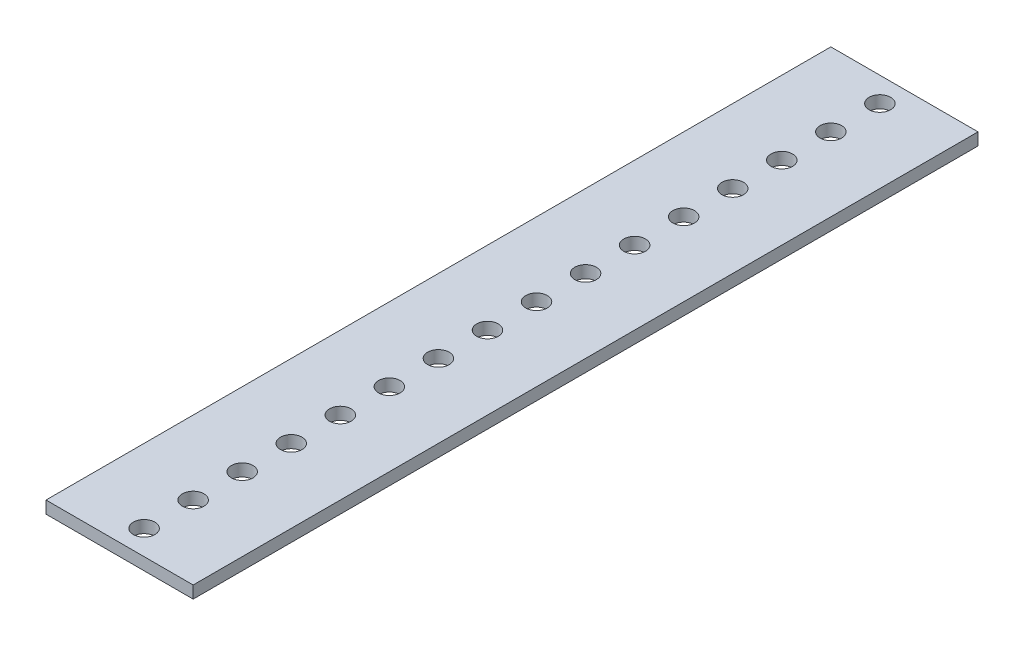
ISO-10303-21;
HEADER;
FILE_DESCRIPTION(('STEP AP214'),'2;1');
FILE_NAME('part.step','',(''),(''),'','','');
FILE_SCHEMA(('AUTOMOTIVE_DESIGN { 1 0 10303 214 1 1 1 1 }'));
ENDSEC;
DATA;
#1=APPLICATION_CONTEXT('core data for automotive mechanical design processes');
#2=APPLICATION_PROTOCOL_DEFINITION('international standard','automotive_design',2000,#1);
#3=PRODUCT_CONTEXT('',#1,'mechanical');
#4=PRODUCT('Part','Part','',(#3));
#5=PRODUCT_RELATED_PRODUCT_CATEGORY('part','',(#4));
#6=PRODUCT_DEFINITION_FORMATION('','',#4);
#7=PRODUCT_DEFINITION_CONTEXT('part definition',#1,'design');
#8=PRODUCT_DEFINITION('design','',#6,#7);
#9=PRODUCT_DEFINITION_SHAPE('','',#8);
#10=(LENGTH_UNIT() NAMED_UNIT(*) SI_UNIT(.MILLI.,.METRE.));
#11=(NAMED_UNIT(*) PLANE_ANGLE_UNIT() SI_UNIT($,.RADIAN.));
#12=(NAMED_UNIT(*) SI_UNIT($,.STERADIAN.) SOLID_ANGLE_UNIT());
#13=UNCERTAINTY_MEASURE_WITH_UNIT(LENGTH_MEASURE(1.E-05),#10,'distance_accuracy_value','');
#14=(GEOMETRIC_REPRESENTATION_CONTEXT(3) GLOBAL_UNCERTAINTY_ASSIGNED_CONTEXT((#13)) GLOBAL_UNIT_ASSIGNED_CONTEXT((#10,
#11,#12)) REPRESENTATION_CONTEXT('',''));
#15=CARTESIAN_POINT('',(0.,0.,0.));
#16=DIRECTION('',(0.,0.,1.));
#17=DIRECTION('',(1.,0.,0.));
#18=AXIS2_PLACEMENT_3D('',#15,#16,#17);
#19=CARTESIAN_POINT('',(0.,0.,-95.25));
#20=DIRECTION('',(0.,1.,0.));
#21=DIRECTION('',(0.,0.,1.));
#22=AXIS2_PLACEMENT_3D('',#19,#20,#21);
#23=CYLINDRICAL_SURFACE('',#22,2.79400000000001);
#24=CARTESIAN_POINT('',(0.,0.,-95.25));
#25=DIRECTION('',(0.,1.,0.));
#26=DIRECTION('',(0.,0.,1.));
#27=AXIS2_PLACEMENT_3D('',#24,#25,#26);
#28=CIRCLE('',#27,2.79400000000001);
#29=CARTESIAN_POINT('',(0.,0.,-92.456));
#30=VERTEX_POINT('',#29);
#31=EDGE_CURVE('E45',#30,#30,#28,.T.);
#32=ORIENTED_EDGE('',*,*,#31,.F.);
#33=EDGE_LOOP('',(#32));
#34=FACE_BOUND('',#33,.T.);
#35=CARTESIAN_POINT('',(0.,3.175,-95.25));
#36=DIRECTION('',(0.,1.,0.));
#37=DIRECTION('',(0.,0.,1.));
#38=AXIS2_PLACEMENT_3D('',#35,#36,#37);
#39=CIRCLE('',#38,2.79400000000001);
#40=CARTESIAN_POINT('',(0.,3.175,-92.456));
#41=VERTEX_POINT('',#40);
#42=EDGE_CURVE('E11',#41,#41,#39,.T.);
#43=ORIENTED_EDGE('',*,*,#42,.T.);
#44=EDGE_LOOP('',(#43));
#45=FACE_BOUND('',#44,.T.);
#46=ADVANCED_FACE('F37',(#34,#45),#23,.F.);
#47=CARTESIAN_POINT('',(0.,0.,-82.55));
#48=DIRECTION('',(0.,1.,0.));
#49=DIRECTION('',(0.,0.,1.));
#50=AXIS2_PLACEMENT_3D('',#47,#48,#49);
#51=CYLINDRICAL_SURFACE('',#50,2.79400000000001);
#52=CARTESIAN_POINT('',(0.,0.,-82.55));
#53=DIRECTION('',(0.,1.,0.));
#54=DIRECTION('',(0.,0.,1.));
#55=AXIS2_PLACEMENT_3D('',#52,#53,#54);
#56=CIRCLE('',#55,2.79400000000001);
#57=CARTESIAN_POINT('',(0.,0.,-79.756));
#58=VERTEX_POINT('',#57);
#59=EDGE_CURVE('E187',#58,#58,#56,.T.);
#60=ORIENTED_EDGE('',*,*,#59,.F.);
#61=EDGE_LOOP('',(#60));
#62=FACE_BOUND('',#61,.T.);
#63=CARTESIAN_POINT('',(0.,3.175,-82.55));
#64=DIRECTION('',(0.,1.,0.));
#65=DIRECTION('',(0.,0.,1.));
#66=AXIS2_PLACEMENT_3D('',#63,#64,#65);
#67=CIRCLE('',#66,2.79400000000001);
#68=CARTESIAN_POINT('',(0.,3.175,-79.756));
#69=VERTEX_POINT('',#68);
#70=EDGE_CURVE('E190',#69,#69,#67,.T.);
#71=ORIENTED_EDGE('',*,*,#70,.T.);
#72=EDGE_LOOP('',(#71));
#73=FACE_BOUND('',#72,.T.);
#74=ADVANCED_FACE('F199',(#62,#73),#51,.F.);
#75=CARTESIAN_POINT('',(0.,0.,-69.85));
#76=DIRECTION('',(0.,1.,0.));
#77=DIRECTION('',(0.,0.,1.));
#78=AXIS2_PLACEMENT_3D('',#75,#76,#77);
#79=CYLINDRICAL_SURFACE('',#78,2.79400000000001);
#80=CARTESIAN_POINT('',(0.,0.,-69.85));
#81=DIRECTION('',(0.,1.,0.));
#82=DIRECTION('',(0.,0.,1.));
#83=AXIS2_PLACEMENT_3D('',#80,#81,#82);
#84=CIRCLE('',#83,2.79400000000001);
#85=CARTESIAN_POINT('',(0.,0.,-67.056));
#86=VERTEX_POINT('',#85);
#87=EDGE_CURVE('E181',#86,#86,#84,.T.);
#88=ORIENTED_EDGE('',*,*,#87,.F.);
#89=EDGE_LOOP('',(#88));
#90=FACE_BOUND('',#89,.T.);
#91=CARTESIAN_POINT('',(0.,3.175,-69.85));
#92=DIRECTION('',(0.,1.,0.));
#93=DIRECTION('',(0.,0.,1.));
#94=AXIS2_PLACEMENT_3D('',#91,#92,#93);
#95=CIRCLE('',#94,2.79400000000001);
#96=CARTESIAN_POINT('',(0.,3.175,-67.056));
#97=VERTEX_POINT('',#96);
#98=EDGE_CURVE('E184',#97,#97,#95,.T.);
#99=ORIENTED_EDGE('',*,*,#98,.T.);
#100=EDGE_LOOP('',(#99));
#101=FACE_BOUND('',#100,.T.);
#102=ADVANCED_FACE('F270',(#90,#101),#79,.F.);
#103=CARTESIAN_POINT('',(0.,0.,-57.15));
#104=DIRECTION('',(0.,1.,0.));
#105=DIRECTION('',(0.,0.,1.));
#106=AXIS2_PLACEMENT_3D('',#103,#104,#105);
#107=CYLINDRICAL_SURFACE('',#106,2.79400000000001);
#108=CARTESIAN_POINT('',(0.,0.,-57.15));
#109=DIRECTION('',(0.,1.,0.));
#110=DIRECTION('',(0.,0.,1.));
#111=AXIS2_PLACEMENT_3D('',#108,#109,#110);
#112=CIRCLE('',#111,2.79400000000001);
#113=CARTESIAN_POINT('',(0.,0.,-54.356));
#114=VERTEX_POINT('',#113);
#115=EDGE_CURVE('E175',#114,#114,#112,.T.);
#116=ORIENTED_EDGE('',*,*,#115,.F.);
#117=EDGE_LOOP('',(#116));
#118=FACE_BOUND('',#117,.T.);
#119=CARTESIAN_POINT('',(0.,3.175,-57.15));
#120=DIRECTION('',(0.,1.,0.));
#121=DIRECTION('',(0.,0.,1.));
#122=AXIS2_PLACEMENT_3D('',#119,#120,#121);
#123=CIRCLE('',#122,2.79400000000001);
#124=CARTESIAN_POINT('',(0.,3.175,-54.356));
#125=VERTEX_POINT('',#124);
#126=EDGE_CURVE('E178',#125,#125,#123,.T.);
#127=ORIENTED_EDGE('',*,*,#126,.T.);
#128=EDGE_LOOP('',(#127));
#129=FACE_BOUND('',#128,.T.);
#130=ADVANCED_FACE('F266',(#118,#129),#107,.F.);
#131=CARTESIAN_POINT('',(0.,0.,-44.45));
#132=DIRECTION('',(0.,1.,0.));
#133=DIRECTION('',(0.,0.,1.));
#134=AXIS2_PLACEMENT_3D('',#131,#132,#133);
#135=CYLINDRICAL_SURFACE('',#134,2.79400000000001);
#136=CARTESIAN_POINT('',(0.,0.,-44.45));
#137=DIRECTION('',(0.,1.,0.));
#138=DIRECTION('',(0.,0.,1.));
#139=AXIS2_PLACEMENT_3D('',#136,#137,#138);
#140=CIRCLE('',#139,2.79400000000001);
#141=CARTESIAN_POINT('',(0.,0.,-41.656));
#142=VERTEX_POINT('',#141);
#143=EDGE_CURVE('E169',#142,#142,#140,.T.);
#144=ORIENTED_EDGE('',*,*,#143,.F.);
#145=EDGE_LOOP('',(#144));
#146=FACE_BOUND('',#145,.T.);
#147=CARTESIAN_POINT('',(0.,3.175,-44.45));
#148=DIRECTION('',(0.,1.,0.));
#149=DIRECTION('',(0.,0.,1.));
#150=AXIS2_PLACEMENT_3D('',#147,#148,#149);
#151=CIRCLE('',#150,2.79400000000001);
#152=CARTESIAN_POINT('',(0.,3.175,-41.656));
#153=VERTEX_POINT('',#152);
#154=EDGE_CURVE('E172',#153,#153,#151,.T.);
#155=ORIENTED_EDGE('',*,*,#154,.T.);
#156=EDGE_LOOP('',(#155));
#157=FACE_BOUND('',#156,.T.);
#158=ADVANCED_FACE('F262',(#146,#157),#135,.F.);
#159=CARTESIAN_POINT('',(0.,0.,-31.75));
#160=DIRECTION('',(0.,1.,0.));
#161=DIRECTION('',(0.,0.,1.));
#162=AXIS2_PLACEMENT_3D('',#159,#160,#161);
#163=CYLINDRICAL_SURFACE('',#162,2.79400000000001);
#164=CARTESIAN_POINT('',(0.,0.,-31.75));
#165=DIRECTION('',(0.,1.,0.));
#166=DIRECTION('',(0.,0.,1.));
#167=AXIS2_PLACEMENT_3D('',#164,#165,#166);
#168=CIRCLE('',#167,2.79400000000001);
#169=CARTESIAN_POINT('',(0.,0.,-28.956));
#170=VERTEX_POINT('',#169);
#171=EDGE_CURVE('E163',#170,#170,#168,.T.);
#172=ORIENTED_EDGE('',*,*,#171,.F.);
#173=EDGE_LOOP('',(#172));
#174=FACE_BOUND('',#173,.T.);
#175=CARTESIAN_POINT('',(0.,3.175,-31.75));
#176=DIRECTION('',(0.,1.,0.));
#177=DIRECTION('',(0.,0.,1.));
#178=AXIS2_PLACEMENT_3D('',#175,#176,#177);
#179=CIRCLE('',#178,2.79400000000001);
#180=CARTESIAN_POINT('',(0.,3.175,-28.956));
#181=VERTEX_POINT('',#180);
#182=EDGE_CURVE('E166',#181,#181,#179,.T.);
#183=ORIENTED_EDGE('',*,*,#182,.T.);
#184=EDGE_LOOP('',(#183));
#185=FACE_BOUND('',#184,.T.);
#186=ADVANCED_FACE('F258',(#174,#185),#163,.F.);
#187=CARTESIAN_POINT('',(0.,0.,-19.05));
#188=DIRECTION('',(0.,1.,0.));
#189=DIRECTION('',(0.,0.,1.));
#190=AXIS2_PLACEMENT_3D('',#187,#188,#189);
#191=CYLINDRICAL_SURFACE('',#190,2.79400000000001);
#192=CARTESIAN_POINT('',(0.,0.,-19.05));
#193=DIRECTION('',(0.,1.,0.));
#194=DIRECTION('',(0.,0.,1.));
#195=AXIS2_PLACEMENT_3D('',#192,#193,#194);
#196=CIRCLE('',#195,2.79400000000001);
#197=CARTESIAN_POINT('',(0.,0.,-16.256));
#198=VERTEX_POINT('',#197);
#199=EDGE_CURVE('E157',#198,#198,#196,.T.);
#200=ORIENTED_EDGE('',*,*,#199,.F.);
#201=EDGE_LOOP('',(#200));
#202=FACE_BOUND('',#201,.T.);
#203=CARTESIAN_POINT('',(0.,3.175,-19.05));
#204=DIRECTION('',(0.,1.,0.));
#205=DIRECTION('',(0.,0.,1.));
#206=AXIS2_PLACEMENT_3D('',#203,#204,#205);
#207=CIRCLE('',#206,2.79400000000001);
#208=CARTESIAN_POINT('',(0.,3.175,-16.256));
#209=VERTEX_POINT('',#208);
#210=EDGE_CURVE('E160',#209,#209,#207,.T.);
#211=ORIENTED_EDGE('',*,*,#210,.T.);
#212=EDGE_LOOP('',(#211));
#213=FACE_BOUND('',#212,.T.);
#214=ADVANCED_FACE('F254',(#202,#213),#191,.F.);
#215=CARTESIAN_POINT('',(0.,0.,-6.35000000000001));
#216=DIRECTION('',(0.,1.,0.));
#217=DIRECTION('',(0.,0.,1.));
#218=AXIS2_PLACEMENT_3D('',#215,#216,#217);
#219=CYLINDRICAL_SURFACE('',#218,2.79400000000001);
#220=CARTESIAN_POINT('',(0.,0.,-6.35000000000001));
#221=DIRECTION('',(0.,1.,0.));
#222=DIRECTION('',(0.,0.,1.));
#223=AXIS2_PLACEMENT_3D('',#220,#221,#222);
#224=CIRCLE('',#223,2.79400000000001);
#225=CARTESIAN_POINT('',(0.,0.,-3.556));
#226=VERTEX_POINT('',#225);
#227=EDGE_CURVE('E151',#226,#226,#224,.T.);
#228=ORIENTED_EDGE('',*,*,#227,.F.);
#229=EDGE_LOOP('',(#228));
#230=FACE_BOUND('',#229,.T.);
#231=CARTESIAN_POINT('',(0.,3.175,-6.35000000000001));
#232=DIRECTION('',(0.,1.,0.));
#233=DIRECTION('',(0.,0.,1.));
#234=AXIS2_PLACEMENT_3D('',#231,#232,#233);
#235=CIRCLE('',#234,2.79400000000001);
#236=CARTESIAN_POINT('',(0.,3.175,-3.556));
#237=VERTEX_POINT('',#236);
#238=EDGE_CURVE('E154',#237,#237,#235,.T.);
#239=ORIENTED_EDGE('',*,*,#238,.T.);
#240=EDGE_LOOP('',(#239));
#241=FACE_BOUND('',#240,.T.);
#242=ADVANCED_FACE('F250',(#230,#241),#219,.F.);
#243=CARTESIAN_POINT('',(0.,0.,6.34999999999999));
#244=DIRECTION('',(0.,1.,0.));
#245=DIRECTION('',(0.,0.,1.));
#246=AXIS2_PLACEMENT_3D('',#243,#244,#245);
#247=CYLINDRICAL_SURFACE('',#246,2.79400000000001);
#248=CARTESIAN_POINT('',(0.,0.,6.34999999999999));
#249=DIRECTION('',(0.,1.,0.));
#250=DIRECTION('',(0.,0.,1.));
#251=AXIS2_PLACEMENT_3D('',#248,#249,#250);
#252=CIRCLE('',#251,2.79400000000001);
#253=CARTESIAN_POINT('',(0.,0.,9.144));
#254=VERTEX_POINT('',#253);
#255=EDGE_CURVE('E145',#254,#254,#252,.T.);
#256=ORIENTED_EDGE('',*,*,#255,.F.);
#257=EDGE_LOOP('',(#256));
#258=FACE_BOUND('',#257,.T.);
#259=CARTESIAN_POINT('',(0.,3.175,6.34999999999999));
#260=DIRECTION('',(0.,1.,0.));
#261=DIRECTION('',(0.,0.,1.));
#262=AXIS2_PLACEMENT_3D('',#259,#260,#261);
#263=CIRCLE('',#262,2.79400000000001);
#264=CARTESIAN_POINT('',(0.,3.175,9.144));
#265=VERTEX_POINT('',#264);
#266=EDGE_CURVE('E148',#265,#265,#263,.T.);
#267=ORIENTED_EDGE('',*,*,#266,.T.);
#268=EDGE_LOOP('',(#267));
#269=FACE_BOUND('',#268,.T.);
#270=ADVANCED_FACE('F246',(#258,#269),#247,.F.);
#271=CARTESIAN_POINT('',(0.,0.,19.05));
#272=DIRECTION('',(0.,1.,0.));
#273=DIRECTION('',(0.,0.,1.));
#274=AXIS2_PLACEMENT_3D('',#271,#272,#273);
#275=CYLINDRICAL_SURFACE('',#274,2.79400000000001);
#276=CARTESIAN_POINT('',(0.,0.,19.05));
#277=DIRECTION('',(0.,1.,0.));
#278=DIRECTION('',(0.,0.,1.));
#279=AXIS2_PLACEMENT_3D('',#276,#277,#278);
#280=CIRCLE('',#279,2.79400000000001);
#281=CARTESIAN_POINT('',(0.,0.,21.844));
#282=VERTEX_POINT('',#281);
#283=EDGE_CURVE('E139',#282,#282,#280,.T.);
#284=ORIENTED_EDGE('',*,*,#283,.F.);
#285=EDGE_LOOP('',(#284));
#286=FACE_BOUND('',#285,.T.);
#287=CARTESIAN_POINT('',(0.,3.175,19.05));
#288=DIRECTION('',(0.,1.,0.));
#289=DIRECTION('',(0.,0.,1.));
#290=AXIS2_PLACEMENT_3D('',#287,#288,#289);
#291=CIRCLE('',#290,2.79400000000001);
#292=CARTESIAN_POINT('',(0.,3.175,21.844));
#293=VERTEX_POINT('',#292);
#294=EDGE_CURVE('E142',#293,#293,#291,.T.);
#295=ORIENTED_EDGE('',*,*,#294,.T.);
#296=EDGE_LOOP('',(#295));
#297=FACE_BOUND('',#296,.T.);
#298=ADVANCED_FACE('F242',(#286,#297),#275,.F.);
#299=CARTESIAN_POINT('',(0.,0.,31.75));
#300=DIRECTION('',(0.,1.,0.));
#301=DIRECTION('',(0.,0.,1.));
#302=AXIS2_PLACEMENT_3D('',#299,#300,#301);
#303=CYLINDRICAL_SURFACE('',#302,2.79400000000001);
#304=CARTESIAN_POINT('',(0.,0.,31.75));
#305=DIRECTION('',(0.,1.,0.));
#306=DIRECTION('',(0.,0.,1.));
#307=AXIS2_PLACEMENT_3D('',#304,#305,#306);
#308=CIRCLE('',#307,2.79400000000001);
#309=CARTESIAN_POINT('',(0.,0.,34.544));
#310=VERTEX_POINT('',#309);
#311=EDGE_CURVE('E133',#310,#310,#308,.T.);
#312=ORIENTED_EDGE('',*,*,#311,.F.);
#313=EDGE_LOOP('',(#312));
#314=FACE_BOUND('',#313,.T.);
#315=CARTESIAN_POINT('',(0.,3.175,31.75));
#316=DIRECTION('',(0.,1.,0.));
#317=DIRECTION('',(0.,0.,1.));
#318=AXIS2_PLACEMENT_3D('',#315,#316,#317);
#319=CIRCLE('',#318,2.79400000000001);
#320=CARTESIAN_POINT('',(0.,3.175,34.544));
#321=VERTEX_POINT('',#320);
#322=EDGE_CURVE('E136',#321,#321,#319,.T.);
#323=ORIENTED_EDGE('',*,*,#322,.T.);
#324=EDGE_LOOP('',(#323));
#325=FACE_BOUND('',#324,.T.);
#326=ADVANCED_FACE('F238',(#314,#325),#303,.F.);
#327=CARTESIAN_POINT('',(0.,0.,44.45));
#328=DIRECTION('',(0.,1.,0.));
#329=DIRECTION('',(0.,0.,1.));
#330=AXIS2_PLACEMENT_3D('',#327,#328,#329);
#331=CYLINDRICAL_SURFACE('',#330,2.79400000000001);
#332=CARTESIAN_POINT('',(0.,0.,44.45));
#333=DIRECTION('',(0.,1.,0.));
#334=DIRECTION('',(0.,0.,1.));
#335=AXIS2_PLACEMENT_3D('',#332,#333,#334);
#336=CIRCLE('',#335,2.79400000000001);
#337=CARTESIAN_POINT('',(0.,0.,47.244));
#338=VERTEX_POINT('',#337);
#339=EDGE_CURVE('E127',#338,#338,#336,.T.);
#340=ORIENTED_EDGE('',*,*,#339,.F.);
#341=EDGE_LOOP('',(#340));
#342=FACE_BOUND('',#341,.T.);
#343=CARTESIAN_POINT('',(0.,3.175,44.45));
#344=DIRECTION('',(0.,1.,0.));
#345=DIRECTION('',(0.,0.,1.));
#346=AXIS2_PLACEMENT_3D('',#343,#344,#345);
#347=CIRCLE('',#346,2.79400000000001);
#348=CARTESIAN_POINT('',(0.,3.175,47.244));
#349=VERTEX_POINT('',#348);
#350=EDGE_CURVE('E130',#349,#349,#347,.T.);
#351=ORIENTED_EDGE('',*,*,#350,.T.);
#352=EDGE_LOOP('',(#351));
#353=FACE_BOUND('',#352,.T.);
#354=ADVANCED_FACE('F234',(#342,#353),#331,.F.);
#355=CARTESIAN_POINT('',(0.,0.,57.15));
#356=DIRECTION('',(0.,1.,0.));
#357=DIRECTION('',(0.,0.,1.));
#358=AXIS2_PLACEMENT_3D('',#355,#356,#357);
#359=CYLINDRICAL_SURFACE('',#358,2.79400000000001);
#360=CARTESIAN_POINT('',(0.,0.,57.15));
#361=DIRECTION('',(0.,1.,0.));
#362=DIRECTION('',(0.,0.,1.));
#363=AXIS2_PLACEMENT_3D('',#360,#361,#362);
#364=CIRCLE('',#363,2.79400000000001);
#365=CARTESIAN_POINT('',(0.,0.,59.944));
#366=VERTEX_POINT('',#365);
#367=EDGE_CURVE('E121',#366,#366,#364,.T.);
#368=ORIENTED_EDGE('',*,*,#367,.F.);
#369=EDGE_LOOP('',(#368));
#370=FACE_BOUND('',#369,.T.);
#371=CARTESIAN_POINT('',(0.,3.175,57.15));
#372=DIRECTION('',(0.,1.,0.));
#373=DIRECTION('',(0.,0.,1.));
#374=AXIS2_PLACEMENT_3D('',#371,#372,#373);
#375=CIRCLE('',#374,2.79400000000001);
#376=CARTESIAN_POINT('',(0.,3.175,59.944));
#377=VERTEX_POINT('',#376);
#378=EDGE_CURVE('E124',#377,#377,#375,.T.);
#379=ORIENTED_EDGE('',*,*,#378,.T.);
#380=EDGE_LOOP('',(#379));
#381=FACE_BOUND('',#380,.T.);
#382=ADVANCED_FACE('F230',(#370,#381),#359,.F.);
#383=CARTESIAN_POINT('',(0.,0.,69.85));
#384=DIRECTION('',(0.,1.,0.));
#385=DIRECTION('',(0.,0.,1.));
#386=AXIS2_PLACEMENT_3D('',#383,#384,#385);
#387=CYLINDRICAL_SURFACE('',#386,2.79400000000001);
#388=CARTESIAN_POINT('',(0.,0.,69.85));
#389=DIRECTION('',(0.,1.,0.));
#390=DIRECTION('',(0.,0.,1.));
#391=AXIS2_PLACEMENT_3D('',#388,#389,#390);
#392=CIRCLE('',#391,2.79400000000001);
#393=CARTESIAN_POINT('',(0.,0.,72.644));
#394=VERTEX_POINT('',#393);
#395=EDGE_CURVE('E115',#394,#394,#392,.T.);
#396=ORIENTED_EDGE('',*,*,#395,.F.);
#397=EDGE_LOOP('',(#396));
#398=FACE_BOUND('',#397,.T.);
#399=CARTESIAN_POINT('',(0.,3.175,69.85));
#400=DIRECTION('',(0.,1.,0.));
#401=DIRECTION('',(0.,0.,1.));
#402=AXIS2_PLACEMENT_3D('',#399,#400,#401);
#403=CIRCLE('',#402,2.79400000000001);
#404=CARTESIAN_POINT('',(0.,3.175,72.644));
#405=VERTEX_POINT('',#404);
#406=EDGE_CURVE('E118',#405,#405,#403,.T.);
#407=ORIENTED_EDGE('',*,*,#406,.T.);
#408=EDGE_LOOP('',(#407));
#409=FACE_BOUND('',#408,.T.);
#410=ADVANCED_FACE('F226',(#398,#409),#387,.F.);
#411=CARTESIAN_POINT('',(19.05,3.175,101.6));
#412=DIRECTION('',(-1.,0.,0.));
#413=DIRECTION('',(0.,0.,1.));
#414=AXIS2_PLACEMENT_3D('',#411,#412,#413);
#415=PLANE('',#414);
#416=DIRECTION('',(0.,0.,-1.));
#417=VECTOR('',#416,1.);
#418=CARTESIAN_POINT('',(19.05,0.,101.6));
#419=LINE('',#418,#417);
#420=CARTESIAN_POINT('',(19.05,0.,101.6));
#421=VERTEX_POINT('',#420);
#422=CARTESIAN_POINT('',(19.05,0.,-101.6));
#423=VERTEX_POINT('',#422);
#424=EDGE_CURVE('E105',#421,#423,#419,.T.);
#425=ORIENTED_EDGE('',*,*,#424,.T.);
#426=DIRECTION('',(0.,-1.,0.));
#427=VECTOR('',#426,1.);
#428=CARTESIAN_POINT('',(19.05,3.175,-101.6));
#429=LINE('',#428,#427);
#430=CARTESIAN_POINT('',(19.05,3.175,-101.6));
#431=VERTEX_POINT('',#430);
#432=EDGE_CURVE('E96',#431,#423,#429,.T.);
#433=ORIENTED_EDGE('',*,*,#432,.F.);
#434=DIRECTION('',(0.,0.,-1.));
#435=VECTOR('',#434,1.);
#436=CARTESIAN_POINT('',(19.05,3.175,101.6));
#437=LINE('',#436,#435);
#438=CARTESIAN_POINT('',(19.05,3.175,101.6));
#439=VERTEX_POINT('',#438);
#440=EDGE_CURVE('E90',#439,#431,#437,.T.);
#441=ORIENTED_EDGE('',*,*,#440,.F.);
#442=DIRECTION('',(0.,-1.,0.));
#443=VECTOR('',#442,1.);
#444=CARTESIAN_POINT('',(19.05,3.175,101.6));
#445=LINE('',#444,#443);
#446=EDGE_CURVE('E101',#439,#421,#445,.T.);
#447=ORIENTED_EDGE('',*,*,#446,.T.);
#448=EDGE_LOOP('',(#425,#433,#441,#447));
#449=FACE_BOUND('',#448,.T.);
#450=ADVANCED_FACE('F223',(#449),#415,.F.);
#451=CARTESIAN_POINT('',(-19.05,3.175,-101.6));
#452=DIRECTION('',(0.,0.,1.));
#453=DIRECTION('',(1.,0.,0.));
#454=AXIS2_PLACEMENT_3D('',#451,#452,#453);
#455=PLANE('',#454);
#456=DIRECTION('',(-1.,0.,0.));
#457=VECTOR('',#456,1.);
#458=CARTESIAN_POINT('',(-19.05,0.,-101.6));
#459=LINE('',#458,#457);
#460=CARTESIAN_POINT('',(-19.05,0.,-101.6));
#461=VERTEX_POINT('',#460);
#462=EDGE_CURVE('E95',#423,#461,#459,.T.);
#463=ORIENTED_EDGE('',*,*,#462,.T.);
#464=DIRECTION('',(0.,-1.,0.));
#465=VECTOR('',#464,1.);
#466=CARTESIAN_POINT('',(-19.05,3.175,-101.6));
#467=LINE('',#466,#465);
#468=CARTESIAN_POINT('',(-19.05,3.175,-101.6));
#469=VERTEX_POINT('',#468);
#470=EDGE_CURVE('E93',#469,#461,#467,.T.);
#471=ORIENTED_EDGE('',*,*,#470,.F.);
#472=DIRECTION('',(-1.,0.,0.));
#473=VECTOR('',#472,1.);
#474=CARTESIAN_POINT('',(-19.05,3.175,-101.6));
#475=LINE('',#474,#473);
#476=EDGE_CURVE('E84',#431,#469,#475,.T.);
#477=ORIENTED_EDGE('',*,*,#476,.F.);
#478=ORIENTED_EDGE('',*,*,#432,.T.);
#479=EDGE_LOOP('',(#463,#471,#477,#478));
#480=FACE_BOUND('',#479,.T.);
#481=ADVANCED_FACE('F94',(#480),#455,.F.);
#482=CARTESIAN_POINT('',(-19.05,3.175,101.6));
#483=DIRECTION('',(1.,0.,0.));
#484=DIRECTION('',(0.,0.,-1.));
#485=AXIS2_PLACEMENT_3D('',#482,#483,#484);
#486=PLANE('',#485);
#487=DIRECTION('',(0.,0.,1.));
#488=VECTOR('',#487,1.);
#489=CARTESIAN_POINT('',(-19.05,0.,101.6));
#490=LINE('',#489,#488);
#491=CARTESIAN_POINT('',(-19.05,0.,101.6));
#492=VERTEX_POINT('',#491);
#493=EDGE_CURVE('E70',#461,#492,#490,.T.);
#494=ORIENTED_EDGE('',*,*,#493,.T.);
#495=DIRECTION('',(0.,-1.,0.));
#496=VECTOR('',#495,1.);
#497=CARTESIAN_POINT('',(-19.05,3.175,101.6));
#498=LINE('',#497,#496);
#499=CARTESIAN_POINT('',(-19.05,3.175,101.6));
#500=VERTEX_POINT('',#499);
#501=EDGE_CURVE('E97',#500,#492,#498,.T.);
#502=ORIENTED_EDGE('',*,*,#501,.F.);
#503=DIRECTION('',(0.,0.,1.));
#504=VECTOR('',#503,1.);
#505=CARTESIAN_POINT('',(-19.05,3.175,101.6));
#506=LINE('',#505,#504);
#507=EDGE_CURVE('E88',#469,#500,#506,.T.);
#508=ORIENTED_EDGE('',*,*,#507,.F.);
#509=ORIENTED_EDGE('',*,*,#470,.T.);
#510=EDGE_LOOP('',(#494,#502,#508,#509));
#511=FACE_BOUND('',#510,.T.);
#512=ADVANCED_FACE('F99',(#511),#486,.F.);
#513=CARTESIAN_POINT('',(-19.05,3.175,101.6));
#514=DIRECTION('',(0.,0.,-1.));
#515=DIRECTION('',(-1.,0.,0.));
#516=AXIS2_PLACEMENT_3D('',#513,#514,#515);
#517=PLANE('',#516);
#518=DIRECTION('',(1.,0.,0.));
#519=VECTOR('',#518,1.);
#520=CARTESIAN_POINT('',(-19.05,0.,101.6));
#521=LINE('',#520,#519);
#522=EDGE_CURVE('E76',#492,#421,#521,.T.);
#523=ORIENTED_EDGE('',*,*,#522,.T.);
#524=ORIENTED_EDGE('',*,*,#446,.F.);
#525=DIRECTION('',(1.,0.,0.));
#526=VECTOR('',#525,1.);
#527=CARTESIAN_POINT('',(-19.05,3.175,101.6));
#528=LINE('',#527,#526);
#529=EDGE_CURVE('E53',#500,#439,#528,.T.);
#530=ORIENTED_EDGE('',*,*,#529,.F.);
#531=ORIENTED_EDGE('',*,*,#501,.T.);
#532=EDGE_LOOP('',(#523,#524,#530,#531));
#533=FACE_BOUND('',#532,.T.);
#534=ADVANCED_FACE('F203',(#533),#517,.F.);
#535=CARTESIAN_POINT('',(0.,3.175,0.));
#536=DIRECTION('',(0.,-1.,0.));
#537=DIRECTION('',(0.,0.,-1.));
#538=AXIS2_PLACEMENT_3D('',#535,#536,#537);
#539=PLANE('',#538);
#540=CARTESIAN_POINT('',(0.,3.175,82.55));
#541=DIRECTION('',(0.,1.,0.));
#542=DIRECTION('',(0.,0.,1.));
#543=AXIS2_PLACEMENT_3D('',#540,#541,#542);
#544=CIRCLE('',#543,2.79400000000001);
#545=CARTESIAN_POINT('',(0.,3.175,85.344));
#546=VERTEX_POINT('',#545);
#547=EDGE_CURVE('E465',#546,#546,#544,.T.);
#548=ORIENTED_EDGE('',*,*,#547,.F.);
#549=EDGE_LOOP('',(#548));
#550=FACE_BOUND('',#549,.T.);
#551=CARTESIAN_POINT('',(0.,3.175,95.25));
#552=DIRECTION('',(0.,1.,0.));
#553=DIRECTION('',(0.,0.,1.));
#554=AXIS2_PLACEMENT_3D('',#551,#552,#553);
#555=CIRCLE('',#554,2.79400000000001);
#556=CARTESIAN_POINT('',(0.,3.175,98.044));
#557=VERTEX_POINT('',#556);
#558=EDGE_CURVE('E466',#557,#557,#555,.T.);
#559=ORIENTED_EDGE('',*,*,#558,.F.);
#560=EDGE_LOOP('',(#559));
#561=FACE_BOUND('',#560,.T.);
#562=ORIENTED_EDGE('',*,*,#440,.T.);
#563=ORIENTED_EDGE('',*,*,#476,.T.);
#564=ORIENTED_EDGE('',*,*,#507,.T.);
#565=ORIENTED_EDGE('',*,*,#529,.T.);
#566=EDGE_LOOP('',(#562,#563,#564,#565));
#567=FACE_BOUND('',#566,.T.);
#568=ORIENTED_EDGE('',*,*,#406,.F.);
#569=EDGE_LOOP('',(#568));
#570=FACE_BOUND('',#569,.T.);
#571=ORIENTED_EDGE('',*,*,#378,.F.);
#572=EDGE_LOOP('',(#571));
#573=FACE_BOUND('',#572,.T.);
#574=ORIENTED_EDGE('',*,*,#350,.F.);
#575=EDGE_LOOP('',(#574));
#576=FACE_BOUND('',#575,.T.);
#577=ORIENTED_EDGE('',*,*,#322,.F.);
#578=EDGE_LOOP('',(#577));
#579=FACE_BOUND('',#578,.T.);
#580=ORIENTED_EDGE('',*,*,#294,.F.);
#581=EDGE_LOOP('',(#580));
#582=FACE_BOUND('',#581,.T.);
#583=ORIENTED_EDGE('',*,*,#266,.F.);
#584=EDGE_LOOP('',(#583));
#585=FACE_BOUND('',#584,.T.);
#586=ORIENTED_EDGE('',*,*,#238,.F.);
#587=EDGE_LOOP('',(#586));
#588=FACE_BOUND('',#587,.T.);
#589=ORIENTED_EDGE('',*,*,#210,.F.);
#590=EDGE_LOOP('',(#589));
#591=FACE_BOUND('',#590,.T.);
#592=ORIENTED_EDGE('',*,*,#182,.F.);
#593=EDGE_LOOP('',(#592));
#594=FACE_BOUND('',#593,.T.);
#595=ORIENTED_EDGE('',*,*,#154,.F.);
#596=EDGE_LOOP('',(#595));
#597=FACE_BOUND('',#596,.T.);
#598=ORIENTED_EDGE('',*,*,#126,.F.);
#599=EDGE_LOOP('',(#598));
#600=FACE_BOUND('',#599,.T.);
#601=ORIENTED_EDGE('',*,*,#98,.F.);
#602=EDGE_LOOP('',(#601));
#603=FACE_BOUND('',#602,.T.);
#604=ORIENTED_EDGE('',*,*,#70,.F.);
#605=EDGE_LOOP('',(#604));
#606=FACE_BOUND('',#605,.T.);
#607=ORIENTED_EDGE('',*,*,#42,.F.);
#608=EDGE_LOOP('',(#607));
#609=FACE_BOUND('',#608,.T.);
#610=ADVANCED_FACE('F85',(#550,#561,#567,#570,#573,#576,#579,#582,#585,#588,#591,#594,#597,#600,
#603,#606,#609),#539,.F.);
#611=CARTESIAN_POINT('',(0.,0.,0.));
#612=DIRECTION('',(0.,-1.,0.));
#613=DIRECTION('',(0.,0.,-1.));
#614=AXIS2_PLACEMENT_3D('',#611,#612,#613);
#615=PLANE('',#614);
#616=CARTESIAN_POINT('',(0.,0.,82.55));
#617=DIRECTION('',(0.,1.,0.));
#618=DIRECTION('',(0.,0.,1.));
#619=AXIS2_PLACEMENT_3D('',#616,#617,#618);
#620=CIRCLE('',#619,2.79400000000001);
#621=CARTESIAN_POINT('',(0.,0.,85.344));
#622=VERTEX_POINT('',#621);
#623=EDGE_CURVE('E463',#622,#622,#620,.T.);
#624=ORIENTED_EDGE('',*,*,#623,.T.);
#625=EDGE_LOOP('',(#624));
#626=FACE_BOUND('',#625,.T.);
#627=CARTESIAN_POINT('',(0.,0.,95.25));
#628=DIRECTION('',(0.,1.,0.));
#629=DIRECTION('',(0.,0.,1.));
#630=AXIS2_PLACEMENT_3D('',#627,#628,#629);
#631=CIRCLE('',#630,2.79400000000001);
#632=CARTESIAN_POINT('',(0.,0.,98.044));
#633=VERTEX_POINT('',#632);
#634=EDGE_CURVE('E108',#633,#633,#631,.T.);
#635=ORIENTED_EDGE('',*,*,#634,.T.);
#636=EDGE_LOOP('',(#635));
#637=FACE_BOUND('',#636,.T.);
#638=ORIENTED_EDGE('',*,*,#424,.F.);
#639=ORIENTED_EDGE('',*,*,#522,.F.);
#640=ORIENTED_EDGE('',*,*,#493,.F.);
#641=ORIENTED_EDGE('',*,*,#462,.F.);
#642=EDGE_LOOP('',(#638,#639,#640,#641));
#643=FACE_BOUND('',#642,.T.);
#644=ORIENTED_EDGE('',*,*,#395,.T.);
#645=EDGE_LOOP('',(#644));
#646=FACE_BOUND('',#645,.T.);
#647=ORIENTED_EDGE('',*,*,#367,.T.);
#648=EDGE_LOOP('',(#647));
#649=FACE_BOUND('',#648,.T.);
#650=ORIENTED_EDGE('',*,*,#339,.T.);
#651=EDGE_LOOP('',(#650));
#652=FACE_BOUND('',#651,.T.);
#653=ORIENTED_EDGE('',*,*,#311,.T.);
#654=EDGE_LOOP('',(#653));
#655=FACE_BOUND('',#654,.T.);
#656=ORIENTED_EDGE('',*,*,#283,.T.);
#657=EDGE_LOOP('',(#656));
#658=FACE_BOUND('',#657,.T.);
#659=ORIENTED_EDGE('',*,*,#255,.T.);
#660=EDGE_LOOP('',(#659));
#661=FACE_BOUND('',#660,.T.);
#662=ORIENTED_EDGE('',*,*,#227,.T.);
#663=EDGE_LOOP('',(#662));
#664=FACE_BOUND('',#663,.T.);
#665=ORIENTED_EDGE('',*,*,#199,.T.);
#666=EDGE_LOOP('',(#665));
#667=FACE_BOUND('',#666,.T.);
#668=ORIENTED_EDGE('',*,*,#171,.T.);
#669=EDGE_LOOP('',(#668));
#670=FACE_BOUND('',#669,.T.);
#671=ORIENTED_EDGE('',*,*,#143,.T.);
#672=EDGE_LOOP('',(#671));
#673=FACE_BOUND('',#672,.T.);
#674=ORIENTED_EDGE('',*,*,#115,.T.);
#675=EDGE_LOOP('',(#674));
#676=FACE_BOUND('',#675,.T.);
#677=ORIENTED_EDGE('',*,*,#87,.T.);
#678=EDGE_LOOP('',(#677));
#679=FACE_BOUND('',#678,.T.);
#680=ORIENTED_EDGE('',*,*,#59,.T.);
#681=EDGE_LOOP('',(#680));
#682=FACE_BOUND('',#681,.T.);
#683=ORIENTED_EDGE('',*,*,#31,.T.);
#684=EDGE_LOOP('',(#683));
#685=FACE_BOUND('',#684,.T.);
#686=ADVANCED_FACE('F195',(#626,#637,#643,#646,#649,#652,#655,#658,#661,#664,#667,#670,#673,
#676,#679,#682,#685),#615,.T.);
#687=CARTESIAN_POINT('',(0.,0.,95.25));
#688=DIRECTION('',(0.,1.,0.));
#689=DIRECTION('',(0.,0.,1.));
#690=AXIS2_PLACEMENT_3D('',#687,#688,#689);
#691=CYLINDRICAL_SURFACE('',#690,2.79400000000001);
#692=ORIENTED_EDGE('',*,*,#634,.F.);
#693=EDGE_LOOP('',(#692));
#694=FACE_BOUND('',#693,.T.);
#695=ORIENTED_EDGE('',*,*,#558,.T.);
#696=EDGE_LOOP('',(#695));
#697=FACE_BOUND('',#696,.T.);
#698=ADVANCED_FACE('F210',(#694,#697),#691,.F.);
#699=CARTESIAN_POINT('',(0.,0.,82.55));
#700=DIRECTION('',(0.,1.,0.));
#701=DIRECTION('',(0.,0.,1.));
#702=AXIS2_PLACEMENT_3D('',#699,#700,#701);
#703=CYLINDRICAL_SURFACE('',#702,2.79400000000001);
#704=ORIENTED_EDGE('',*,*,#623,.F.);
#705=EDGE_LOOP('',(#704));
#706=FACE_BOUND('',#705,.T.);
#707=ORIENTED_EDGE('',*,*,#547,.T.);
#708=EDGE_LOOP('',(#707));
#709=FACE_BOUND('',#708,.T.);
#710=ADVANCED_FACE('F359',(#706,#709),#703,.F.);
#711=CLOSED_SHELL('',(#46,#74,#102,#130,#158,#186,#214,#242,#270,#298,#326,#354,#382,#410,#450,
#481,#512,#534,#610,#686,#698,#710));
#712=MANIFOLD_SOLID_BREP('B2',#711);
#713=ADVANCED_BREP_SHAPE_REPRESENTATION('',(#18,#712),#14);
#714=SHAPE_DEFINITION_REPRESENTATION(#9,#713);
ENDSEC;
END-ISO-10303-21;
